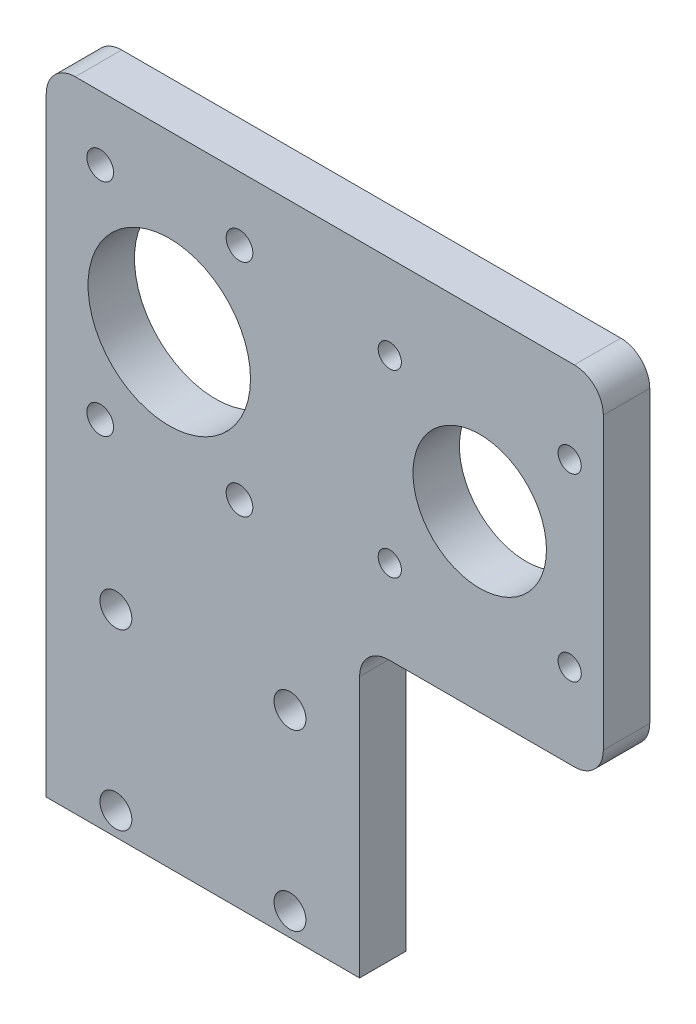
ISO-10303-21;
HEADER;
FILE_DESCRIPTION(('STEP AP214'),'2;1');
FILE_NAME('part.step','',(''),(''),'','','');
FILE_SCHEMA(('AUTOMOTIVE_DESIGN { 1 0 10303 214 1 1 1 1 }'));
ENDSEC;
DATA;
#1=APPLICATION_CONTEXT('core data for automotive mechanical design processes');
#2=APPLICATION_PROTOCOL_DEFINITION('international standard','automotive_design',2000,#1);
#3=PRODUCT_CONTEXT('',#1,'mechanical');
#4=PRODUCT('Part','Part','',(#3));
#5=PRODUCT_RELATED_PRODUCT_CATEGORY('part','',(#4));
#6=PRODUCT_DEFINITION_FORMATION('','',#4);
#7=PRODUCT_DEFINITION_CONTEXT('part definition',#1,'design');
#8=PRODUCT_DEFINITION('design','',#6,#7);
#9=PRODUCT_DEFINITION_SHAPE('','',#8);
#10=(LENGTH_UNIT() NAMED_UNIT(*) SI_UNIT(.MILLI.,.METRE.));
#11=(NAMED_UNIT(*) PLANE_ANGLE_UNIT() SI_UNIT($,.RADIAN.));
#12=(NAMED_UNIT(*) SI_UNIT($,.STERADIAN.) SOLID_ANGLE_UNIT());
#13=UNCERTAINTY_MEASURE_WITH_UNIT(LENGTH_MEASURE(1.E-05),#10,'distance_accuracy_value','');
#14=(GEOMETRIC_REPRESENTATION_CONTEXT(3) GLOBAL_UNCERTAINTY_ASSIGNED_CONTEXT((#13)) GLOBAL_UNIT_ASSIGNED_CONTEXT((#10,
#11,#12)) REPRESENTATION_CONTEXT('',''));
#15=CARTESIAN_POINT('',(0.,0.,0.));
#16=DIRECTION('',(0.,0.,1.));
#17=DIRECTION('',(1.,0.,0.));
#18=AXIS2_PLACEMENT_3D('',#15,#16,#17);
#19=CARTESIAN_POINT('',(0.,0.,8.));
#20=DIRECTION('',(0.,0.,1.));
#21=DIRECTION('',(1.,0.,0.));
#22=AXIS2_PLACEMENT_3D('',#19,#20,#21);
#23=PLANE('',#22);
#24=CARTESIAN_POINT('',(9.3000000000004,-49.,8.));
#25=DIRECTION('',(0.,0.,1.));
#26=DIRECTION('',(1.,0.,0.));
#27=AXIS2_PLACEMENT_3D('',#24,#25,#26);
#28=CIRCLE('',#27,2.3);
#29=CARTESIAN_POINT('',(11.6000000000004,-49.,8.));
#30=VERTEX_POINT('',#29);
#31=EDGE_CURVE('E493',#30,#30,#28,.T.);
#32=ORIENTED_EDGE('',*,*,#31,.F.);
#33=EDGE_LOOP('',(#32));
#34=FACE_BOUND('',#33,.T.);
#35=CARTESIAN_POINT('',(33.3000000000004,-49.,8.));
#36=DIRECTION('',(0.,0.,1.));
#37=DIRECTION('',(1.,0.,0.));
#38=AXIS2_PLACEMENT_3D('',#35,#36,#37);
#39=CIRCLE('',#38,2.30000000000001);
#40=CARTESIAN_POINT('',(35.6000000000004,-49.,8.));
#41=VERTEX_POINT('',#40);
#42=EDGE_CURVE('E494',#41,#41,#39,.T.);
#43=ORIENTED_EDGE('',*,*,#42,.F.);
#44=EDGE_LOOP('',(#43));
#45=FACE_BOUND('',#44,.T.);
#46=CARTESIAN_POINT('',(33.3,-11.,8.));
#47=DIRECTION('',(0.,0.,1.));
#48=DIRECTION('',(1.,0.,0.));
#49=AXIS2_PLACEMENT_3D('',#46,#47,#48);
#50=CIRCLE('',#49,2.3);
#51=CARTESIAN_POINT('',(35.6,-11.,8.));
#52=VERTEX_POINT('',#51);
#53=EDGE_CURVE('E497',#52,#52,#50,.T.);
#54=ORIENTED_EDGE('',*,*,#53,.F.);
#55=EDGE_LOOP('',(#54));
#56=FACE_BOUND('',#55,.T.);
#57=CARTESIAN_POINT('',(9.3,-11.,8.));
#58=DIRECTION('',(0.,0.,1.));
#59=DIRECTION('',(1.,0.,0.));
#60=AXIS2_PLACEMENT_3D('',#57,#58,#59);
#61=CIRCLE('',#60,2.3);
#62=CARTESIAN_POINT('',(11.6,-11.,8.));
#63=VERTEX_POINT('',#62);
#64=EDGE_CURVE('E179',#63,#63,#61,.T.);
#65=ORIENTED_EDGE('',*,*,#64,.F.);
#66=EDGE_LOOP('',(#65));
#67=FACE_BOUND('',#66,.T.);
#68=CARTESIAN_POINT('',(90.2000000000003,-45.5,8.));
#69=DIRECTION('',(0.,0.,1.));
#70=DIRECTION('',(1.,0.,0.));
#71=AXIS2_PLACEMENT_3D('',#68,#69,#70);
#72=CIRCLE('',#71,2.);
#73=CARTESIAN_POINT('',(92.2000000000003,-45.5,8.));
#74=VERTEX_POINT('',#73);
#75=EDGE_CURVE('E199',#74,#74,#72,.T.);
#76=ORIENTED_EDGE('',*,*,#75,.F.);
#77=EDGE_LOOP('',(#76));
#78=FACE_BOUND('',#77,.T.);
#79=CARTESIAN_POINT('',(59.2,-14.5,8.));
#80=DIRECTION('',(0.,0.,1.));
#81=DIRECTION('',(1.,0.,0.));
#82=AXIS2_PLACEMENT_3D('',#79,#80,#81);
#83=CIRCLE('',#82,2.);
#84=CARTESIAN_POINT('',(61.2,-14.5,8.));
#85=VERTEX_POINT('',#84);
#86=EDGE_CURVE('E211',#85,#85,#83,.T.);
#87=ORIENTED_EDGE('',*,*,#86,.F.);
#88=EDGE_LOOP('',(#87));
#89=FACE_BOUND('',#88,.T.);
#90=CARTESIAN_POINT('',(11.9999999999999,-76.,8.));
#91=DIRECTION('',(0.,0.,1.));
#92=DIRECTION('',(1.,0.,0.));
#93=AXIS2_PLACEMENT_3D('',#90,#91,#92);
#94=CIRCLE('',#93,2.75);
#95=CARTESIAN_POINT('',(14.7499999999999,-76.,8.));
#96=VERTEX_POINT('',#95);
#97=EDGE_CURVE('E223',#96,#96,#94,.T.);
#98=ORIENTED_EDGE('',*,*,#97,.F.);
#99=EDGE_LOOP('',(#98));
#100=FACE_BOUND('',#99,.T.);
#101=CARTESIAN_POINT('',(42.,-106.,8.));
#102=DIRECTION('',(0.,0.,1.));
#103=DIRECTION('',(1.,0.,0.));
#104=AXIS2_PLACEMENT_3D('',#101,#102,#103);
#105=CIRCLE('',#104,2.75);
#106=CARTESIAN_POINT('',(44.75,-106.,8.));
#107=VERTEX_POINT('',#106);
#108=EDGE_CURVE('E235',#107,#107,#105,.T.);
#109=ORIENTED_EDGE('',*,*,#108,.F.);
#110=EDGE_LOOP('',(#109));
#111=FACE_BOUND('',#110,.T.);
#112=CARTESIAN_POINT('',(12.,-106.,8.));
#113=DIRECTION('',(0.,0.,1.));
#114=DIRECTION('',(1.,0.,0.));
#115=AXIS2_PLACEMENT_3D('',#112,#113,#114);
#116=CIRCLE('',#115,2.75);
#117=CARTESIAN_POINT('',(14.75,-106.,8.));
#118=VERTEX_POINT('',#117);
#119=EDGE_CURVE('E247',#118,#118,#116,.T.);
#120=ORIENTED_EDGE('',*,*,#119,.F.);
#121=EDGE_LOOP('',(#120));
#122=FACE_BOUND('',#121,.T.);
#123=DIRECTION('',(1.,0.,0.));
#124=VECTOR('',#123,1.);
#125=CARTESIAN_POINT('',(54.,-60.,8.));
#126=LINE('',#125,#124);
#127=CARTESIAN_POINT('',(59.,-60.,8.));
#128=VERTEX_POINT('',#127);
#129=CARTESIAN_POINT('',(91.,-60.,8.));
#130=VERTEX_POINT('',#129);
#131=EDGE_CURVE('E253',#128,#130,#126,.T.);
#132=ORIENTED_EDGE('',*,*,#131,.T.);
#133=CARTESIAN_POINT('',(91.,-55.,8.));
#134=DIRECTION('',(0.,0.,1.));
#135=DIRECTION('',(1.,0.,0.));
#136=AXIS2_PLACEMENT_3D('',#133,#134,#135);
#137=CIRCLE('',#136,5.);
#138=CARTESIAN_POINT('',(96.,-55.,8.));
#139=VERTEX_POINT('',#138);
#140=EDGE_CURVE('E166',#130,#139,#137,.T.);
#141=ORIENTED_EDGE('',*,*,#140,.T.);
#142=DIRECTION('',(0.,1.,0.));
#143=VECTOR('',#142,1.);
#144=CARTESIAN_POINT('',(96.,0.,8.));
#145=LINE('',#144,#143);
#146=CARTESIAN_POINT('',(96.,-5.,8.));
#147=VERTEX_POINT('',#146);
#148=EDGE_CURVE('E255',#139,#147,#145,.T.);
#149=ORIENTED_EDGE('',*,*,#148,.T.);
#150=CARTESIAN_POINT('',(91.,-5.,8.));
#151=DIRECTION('',(0.,0.,1.));
#152=DIRECTION('',(1.,0.,0.));
#153=AXIS2_PLACEMENT_3D('',#150,#151,#152);
#154=CIRCLE('',#153,5.);
#155=CARTESIAN_POINT('',(91.,0.,8.));
#156=VERTEX_POINT('',#155);
#157=EDGE_CURVE('E59',#147,#156,#154,.T.);
#158=ORIENTED_EDGE('',*,*,#157,.T.);
#159=DIRECTION('',(-1.,0.,0.));
#160=VECTOR('',#159,1.);
#161=CARTESIAN_POINT('',(54.,0.,8.));
#162=LINE('',#161,#160);
#163=CARTESIAN_POINT('',(5.00000000000001,0.,8.));
#164=VERTEX_POINT('',#163);
#165=EDGE_CURVE('E145',#156,#164,#162,.T.);
#166=ORIENTED_EDGE('',*,*,#165,.T.);
#167=CARTESIAN_POINT('',(5.,-5.,8.));
#168=DIRECTION('',(0.,0.,1.));
#169=DIRECTION('',(1.,0.,0.));
#170=AXIS2_PLACEMENT_3D('',#167,#168,#169);
#171=CIRCLE('',#170,5.);
#172=CARTESIAN_POINT('',(0.,-5.,8.));
#173=VERTEX_POINT('',#172);
#174=EDGE_CURVE('E121',#164,#173,#171,.T.);
#175=ORIENTED_EDGE('',*,*,#174,.T.);
#176=DIRECTION('',(0.,-1.,0.));
#177=VECTOR('',#176,1.);
#178=CARTESIAN_POINT('',(0.,0.,8.));
#179=LINE('',#178,#177);
#180=CARTESIAN_POINT('',(0.,-110.,8.));
#181=VERTEX_POINT('',#180);
#182=EDGE_CURVE('E113',#173,#181,#179,.T.);
#183=ORIENTED_EDGE('',*,*,#182,.T.);
#184=DIRECTION('',(1.,0.,0.));
#185=VECTOR('',#184,1.);
#186=CARTESIAN_POINT('',(0.,-110.,8.));
#187=LINE('',#186,#185);
#188=CARTESIAN_POINT('',(54.,-110.,8.));
#189=VERTEX_POINT('',#188);
#190=EDGE_CURVE('E118',#181,#189,#187,.T.);
#191=ORIENTED_EDGE('',*,*,#190,.T.);
#192=DIRECTION('',(0.,1.,0.));
#193=VECTOR('',#192,1.);
#194=CARTESIAN_POINT('',(54.,-60.,8.));
#195=LINE('',#194,#193);
#196=CARTESIAN_POINT('',(54.,-65.,8.));
#197=VERTEX_POINT('',#196);
#198=EDGE_CURVE('E135',#189,#197,#195,.T.);
#199=ORIENTED_EDGE('',*,*,#198,.T.);
#200=CARTESIAN_POINT('',(59.,-65.,8.));
#201=DIRECTION('',(0.,0.,1.));
#202=DIRECTION('',(1.,0.,0.));
#203=AXIS2_PLACEMENT_3D('',#200,#201,#202);
#204=CIRCLE('',#203,5.);
#205=EDGE_CURVE('E11',#197,#128,#204,.F.);
#206=ORIENTED_EDGE('',*,*,#205,.T.);
#207=EDGE_LOOP('',(#132,#141,#149,#158,#166,#175,#183,#191,#199,#206));
#208=FACE_BOUND('',#207,.T.);
#209=CARTESIAN_POINT('',(21.2,-30.,8.));
#210=DIRECTION('',(0.,0.,1.));
#211=DIRECTION('',(1.,0.,0.));
#212=AXIS2_PLACEMENT_3D('',#209,#210,#211);
#213=CIRCLE('',#212,14.);
#214=CARTESIAN_POINT('',(35.2,-30.,8.));
#215=VERTEX_POINT('',#214);
#216=EDGE_CURVE('E241',#215,#215,#213,.T.);
#217=ORIENTED_EDGE('',*,*,#216,.F.);
#218=EDGE_LOOP('',(#217));
#219=FACE_BOUND('',#218,.T.);
#220=CARTESIAN_POINT('',(41.9999999999999,-76.,8.));
#221=DIRECTION('',(0.,0.,1.));
#222=DIRECTION('',(1.,0.,0.));
#223=AXIS2_PLACEMENT_3D('',#220,#221,#222);
#224=CIRCLE('',#223,2.75);
#225=CARTESIAN_POINT('',(44.7499999999999,-76.,8.));
#226=VERTEX_POINT('',#225);
#227=EDGE_CURVE('E229',#226,#226,#224,.T.);
#228=ORIENTED_EDGE('',*,*,#227,.F.);
#229=EDGE_LOOP('',(#228));
#230=FACE_BOUND('',#229,.T.);
#231=CARTESIAN_POINT('',(74.7,-30.,8.));
#232=DIRECTION('',(0.,0.,1.));
#233=DIRECTION('',(1.,0.,0.));
#234=AXIS2_PLACEMENT_3D('',#231,#232,#233);
#235=CIRCLE('',#234,11.5);
#236=CARTESIAN_POINT('',(86.2,-30.,8.));
#237=VERTEX_POINT('',#236);
#238=EDGE_CURVE('E217',#237,#237,#235,.T.);
#239=ORIENTED_EDGE('',*,*,#238,.F.);
#240=EDGE_LOOP('',(#239));
#241=FACE_BOUND('',#240,.T.);
#242=CARTESIAN_POINT('',(90.2,-14.5,8.));
#243=DIRECTION('',(0.,0.,1.));
#244=DIRECTION('',(1.,0.,0.));
#245=AXIS2_PLACEMENT_3D('',#242,#243,#244);
#246=CIRCLE('',#245,2.);
#247=CARTESIAN_POINT('',(92.2,-14.5,8.));
#248=VERTEX_POINT('',#247);
#249=EDGE_CURVE('E205',#248,#248,#246,.T.);
#250=ORIENTED_EDGE('',*,*,#249,.F.);
#251=EDGE_LOOP('',(#250));
#252=FACE_BOUND('',#251,.T.);
#253=CARTESIAN_POINT('',(59.2000000000003,-45.5,8.));
#254=DIRECTION('',(0.,0.,1.));
#255=DIRECTION('',(1.,0.,0.));
#256=AXIS2_PLACEMENT_3D('',#253,#254,#255);
#257=CIRCLE('',#256,2.);
#258=CARTESIAN_POINT('',(61.2000000000003,-45.5,8.));
#259=VERTEX_POINT('',#258);
#260=EDGE_CURVE('E190',#259,#259,#257,.T.);
#261=ORIENTED_EDGE('',*,*,#260,.F.);
#262=EDGE_LOOP('',(#261));
#263=FACE_BOUND('',#262,.T.);
#264=ADVANCED_FACE('F35',(#34,#45,#56,#67,#78,#89,#100,#111,#122,#208,#219,#230,#241,#252,#263),
#23,.T.);
#265=CARTESIAN_POINT('',(0.,0.,0.));
#266=DIRECTION('',(0.,0.,1.));
#267=DIRECTION('',(1.,0.,0.));
#268=AXIS2_PLACEMENT_3D('',#265,#266,#267);
#269=PLANE('',#268);
#270=CARTESIAN_POINT('',(9.3000000000004,-49.,0.));
#271=DIRECTION('',(0.,0.,1.));
#272=DIRECTION('',(1.,0.,0.));
#273=AXIS2_PLACEMENT_3D('',#270,#271,#272);
#274=CIRCLE('',#273,2.3);
#275=CARTESIAN_POINT('',(11.6000000000004,-49.,0.));
#276=VERTEX_POINT('',#275);
#277=EDGE_CURVE('E39',#276,#276,#274,.T.);
#278=ORIENTED_EDGE('',*,*,#277,.T.);
#279=EDGE_LOOP('',(#278));
#280=FACE_BOUND('',#279,.T.);
#281=CARTESIAN_POINT('',(33.3000000000004,-49.,0.));
#282=DIRECTION('',(0.,0.,1.));
#283=DIRECTION('',(1.,0.,0.));
#284=AXIS2_PLACEMENT_3D('',#281,#282,#283);
#285=CIRCLE('',#284,2.30000000000001);
#286=CARTESIAN_POINT('',(35.6000000000004,-49.,0.));
#287=VERTEX_POINT('',#286);
#288=EDGE_CURVE('E181',#287,#287,#285,.T.);
#289=ORIENTED_EDGE('',*,*,#288,.T.);
#290=EDGE_LOOP('',(#289));
#291=FACE_BOUND('',#290,.T.);
#292=CARTESIAN_POINT('',(33.3,-11.,0.));
#293=DIRECTION('',(0.,0.,1.));
#294=DIRECTION('',(1.,0.,0.));
#295=AXIS2_PLACEMENT_3D('',#292,#293,#294);
#296=CIRCLE('',#295,2.3);
#297=CARTESIAN_POINT('',(35.6,-11.,0.));
#298=VERTEX_POINT('',#297);
#299=EDGE_CURVE('E178',#298,#298,#296,.T.);
#300=ORIENTED_EDGE('',*,*,#299,.T.);
#301=EDGE_LOOP('',(#300));
#302=FACE_BOUND('',#301,.T.);
#303=CARTESIAN_POINT('',(9.3,-11.,0.));
#304=DIRECTION('',(0.,0.,1.));
#305=DIRECTION('',(1.,0.,0.));
#306=AXIS2_PLACEMENT_3D('',#303,#304,#305);
#307=CIRCLE('',#306,2.3);
#308=CARTESIAN_POINT('',(11.6,-11.,0.));
#309=VERTEX_POINT('',#308);
#310=EDGE_CURVE('E175',#309,#309,#307,.T.);
#311=ORIENTED_EDGE('',*,*,#310,.T.);
#312=EDGE_LOOP('',(#311));
#313=FACE_BOUND('',#312,.T.);
#314=DIRECTION('',(0.,1.,0.));
#315=VECTOR('',#314,1.);
#316=CARTESIAN_POINT('',(96.,0.,0.));
#317=LINE('',#316,#315);
#318=CARTESIAN_POINT('',(96.,-55.,0.));
#319=VERTEX_POINT('',#318);
#320=CARTESIAN_POINT('',(96.,-5.,0.));
#321=VERTEX_POINT('',#320);
#322=EDGE_CURVE('E267',#319,#321,#317,.T.);
#323=ORIENTED_EDGE('',*,*,#322,.F.);
#324=CARTESIAN_POINT('',(91.,-55.,0.));
#325=DIRECTION('',(0.,0.,1.));
#326=DIRECTION('',(1.,0.,0.));
#327=AXIS2_PLACEMENT_3D('',#324,#325,#326);
#328=CIRCLE('',#327,5.);
#329=CARTESIAN_POINT('',(91.,-60.,0.));
#330=VERTEX_POINT('',#329);
#331=EDGE_CURVE('E162',#319,#330,#328,.F.);
#332=ORIENTED_EDGE('',*,*,#331,.T.);
#333=DIRECTION('',(1.,0.,0.));
#334=VECTOR('',#333,1.);
#335=CARTESIAN_POINT('',(54.,-60.,0.));
#336=LINE('',#335,#334);
#337=CARTESIAN_POINT('',(59.,-60.,0.));
#338=VERTEX_POINT('',#337);
#339=EDGE_CURVE('E264',#338,#330,#336,.T.);
#340=ORIENTED_EDGE('',*,*,#339,.F.);
#341=CARTESIAN_POINT('',(59.,-65.,0.));
#342=DIRECTION('',(0.,0.,1.));
#343=DIRECTION('',(1.,0.,0.));
#344=AXIS2_PLACEMENT_3D('',#341,#342,#343);
#345=CIRCLE('',#344,5.);
#346=CARTESIAN_POINT('',(54.,-65.,0.));
#347=VERTEX_POINT('',#346);
#348=EDGE_CURVE('E44',#338,#347,#345,.T.);
#349=ORIENTED_EDGE('',*,*,#348,.T.);
#350=DIRECTION('',(0.,1.,0.));
#351=VECTOR('',#350,1.);
#352=CARTESIAN_POINT('',(54.,-60.,0.));
#353=LINE('',#352,#351);
#354=CARTESIAN_POINT('',(54.,-110.,0.));
#355=VERTEX_POINT('',#354);
#356=EDGE_CURVE('E261',#355,#347,#353,.T.);
#357=ORIENTED_EDGE('',*,*,#356,.F.);
#358=DIRECTION('',(1.,0.,0.));
#359=VECTOR('',#358,1.);
#360=CARTESIAN_POINT('',(0.,-110.,0.));
#361=LINE('',#360,#359);
#362=CARTESIAN_POINT('',(0.,-110.,0.));
#363=VERTEX_POINT('',#362);
#364=EDGE_CURVE('E259',#363,#355,#361,.T.);
#365=ORIENTED_EDGE('',*,*,#364,.F.);
#366=DIRECTION('',(0.,-1.,0.));
#367=VECTOR('',#366,1.);
#368=CARTESIAN_POINT('',(0.,0.,0.));
#369=LINE('',#368,#367);
#370=CARTESIAN_POINT('',(0.,-5.,0.));
#371=VERTEX_POINT('',#370);
#372=EDGE_CURVE('E139',#371,#363,#369,.T.);
#373=ORIENTED_EDGE('',*,*,#372,.F.);
#374=CARTESIAN_POINT('',(5.,-5.,0.));
#375=DIRECTION('',(0.,0.,1.));
#376=DIRECTION('',(1.,0.,0.));
#377=AXIS2_PLACEMENT_3D('',#374,#375,#376);
#378=CIRCLE('',#377,5.);
#379=CARTESIAN_POINT('',(5.,0.,0.));
#380=VERTEX_POINT('',#379);
#381=EDGE_CURVE('E158',#371,#380,#378,.F.);
#382=ORIENTED_EDGE('',*,*,#381,.T.);
#383=DIRECTION('',(-1.,0.,0.));
#384=VECTOR('',#383,1.);
#385=CARTESIAN_POINT('',(0.,0.,0.));
#386=LINE('',#385,#384);
#387=CARTESIAN_POINT('',(91.,0.,0.));
#388=VERTEX_POINT('',#387);
#389=EDGE_CURVE('E126',#388,#380,#386,.T.);
#390=ORIENTED_EDGE('',*,*,#389,.F.);
#391=CARTESIAN_POINT('',(91.,-5.,0.));
#392=DIRECTION('',(0.,0.,1.));
#393=DIRECTION('',(1.,0.,0.));
#394=AXIS2_PLACEMENT_3D('',#391,#392,#393);
#395=CIRCLE('',#394,5.);
#396=EDGE_CURVE('E160',#388,#321,#395,.F.);
#397=ORIENTED_EDGE('',*,*,#396,.T.);
#398=EDGE_LOOP('',(#323,#332,#340,#349,#357,#365,#373,#382,#390,#397));
#399=FACE_BOUND('',#398,.T.);
#400=CARTESIAN_POINT('',(12.,-106.,0.));
#401=DIRECTION('',(0.,0.,1.));
#402=DIRECTION('',(1.,0.,0.));
#403=AXIS2_PLACEMENT_3D('',#400,#401,#402);
#404=CIRCLE('',#403,2.75);
#405=CARTESIAN_POINT('',(14.75,-106.,0.));
#406=VERTEX_POINT('',#405);
#407=EDGE_CURVE('E244',#406,#406,#404,.T.);
#408=ORIENTED_EDGE('',*,*,#407,.T.);
#409=EDGE_LOOP('',(#408));
#410=FACE_BOUND('',#409,.T.);
#411=CARTESIAN_POINT('',(21.2,-30.,0.));
#412=DIRECTION('',(0.,0.,1.));
#413=DIRECTION('',(1.,0.,0.));
#414=AXIS2_PLACEMENT_3D('',#411,#412,#413);
#415=CIRCLE('',#414,14.);
#416=CARTESIAN_POINT('',(35.2,-30.,0.));
#417=VERTEX_POINT('',#416);
#418=EDGE_CURVE('E238',#417,#417,#415,.T.);
#419=ORIENTED_EDGE('',*,*,#418,.T.);
#420=EDGE_LOOP('',(#419));
#421=FACE_BOUND('',#420,.T.);
#422=CARTESIAN_POINT('',(42.,-106.,0.));
#423=DIRECTION('',(0.,0.,1.));
#424=DIRECTION('',(1.,0.,0.));
#425=AXIS2_PLACEMENT_3D('',#422,#423,#424);
#426=CIRCLE('',#425,2.75);
#427=CARTESIAN_POINT('',(44.75,-106.,0.));
#428=VERTEX_POINT('',#427);
#429=EDGE_CURVE('E232',#428,#428,#426,.T.);
#430=ORIENTED_EDGE('',*,*,#429,.T.);
#431=EDGE_LOOP('',(#430));
#432=FACE_BOUND('',#431,.T.);
#433=CARTESIAN_POINT('',(41.9999999999999,-76.,0.));
#434=DIRECTION('',(0.,0.,1.));
#435=DIRECTION('',(1.,0.,0.));
#436=AXIS2_PLACEMENT_3D('',#433,#434,#435);
#437=CIRCLE('',#436,2.75);
#438=CARTESIAN_POINT('',(44.7499999999999,-76.,0.));
#439=VERTEX_POINT('',#438);
#440=EDGE_CURVE('E226',#439,#439,#437,.T.);
#441=ORIENTED_EDGE('',*,*,#440,.T.);
#442=EDGE_LOOP('',(#441));
#443=FACE_BOUND('',#442,.T.);
#444=CARTESIAN_POINT('',(11.9999999999999,-76.,0.));
#445=DIRECTION('',(0.,0.,1.));
#446=DIRECTION('',(1.,0.,0.));
#447=AXIS2_PLACEMENT_3D('',#444,#445,#446);
#448=CIRCLE('',#447,2.75);
#449=CARTESIAN_POINT('',(14.7499999999999,-76.,0.));
#450=VERTEX_POINT('',#449);
#451=EDGE_CURVE('E220',#450,#450,#448,.T.);
#452=ORIENTED_EDGE('',*,*,#451,.T.);
#453=EDGE_LOOP('',(#452));
#454=FACE_BOUND('',#453,.T.);
#455=CARTESIAN_POINT('',(74.7,-30.,0.));
#456=DIRECTION('',(0.,0.,1.));
#457=DIRECTION('',(1.,0.,0.));
#458=AXIS2_PLACEMENT_3D('',#455,#456,#457);
#459=CIRCLE('',#458,11.5);
#460=CARTESIAN_POINT('',(86.2,-30.,0.));
#461=VERTEX_POINT('',#460);
#462=EDGE_CURVE('E214',#461,#461,#459,.T.);
#463=ORIENTED_EDGE('',*,*,#462,.T.);
#464=EDGE_LOOP('',(#463));
#465=FACE_BOUND('',#464,.T.);
#466=CARTESIAN_POINT('',(59.2,-14.5,0.));
#467=DIRECTION('',(0.,0.,1.));
#468=DIRECTION('',(1.,0.,0.));
#469=AXIS2_PLACEMENT_3D('',#466,#467,#468);
#470=CIRCLE('',#469,2.);
#471=CARTESIAN_POINT('',(61.2,-14.5,0.));
#472=VERTEX_POINT('',#471);
#473=EDGE_CURVE('E208',#472,#472,#470,.T.);
#474=ORIENTED_EDGE('',*,*,#473,.T.);
#475=EDGE_LOOP('',(#474));
#476=FACE_BOUND('',#475,.T.);
#477=CARTESIAN_POINT('',(90.2,-14.5,0.));
#478=DIRECTION('',(0.,0.,1.));
#479=DIRECTION('',(1.,0.,0.));
#480=AXIS2_PLACEMENT_3D('',#477,#478,#479);
#481=CIRCLE('',#480,2.);
#482=CARTESIAN_POINT('',(92.2,-14.5,0.));
#483=VERTEX_POINT('',#482);
#484=EDGE_CURVE('E202',#483,#483,#481,.T.);
#485=ORIENTED_EDGE('',*,*,#484,.T.);
#486=EDGE_LOOP('',(#485));
#487=FACE_BOUND('',#486,.T.);
#488=CARTESIAN_POINT('',(90.2000000000003,-45.5,0.));
#489=DIRECTION('',(0.,0.,1.));
#490=DIRECTION('',(1.,0.,0.));
#491=AXIS2_PLACEMENT_3D('',#488,#489,#490);
#492=CIRCLE('',#491,2.);
#493=CARTESIAN_POINT('',(92.2000000000003,-45.5,0.));
#494=VERTEX_POINT('',#493);
#495=EDGE_CURVE('E195',#494,#494,#492,.T.);
#496=ORIENTED_EDGE('',*,*,#495,.T.);
#497=EDGE_LOOP('',(#496));
#498=FACE_BOUND('',#497,.T.);
#499=CARTESIAN_POINT('',(59.2000000000003,-45.5,0.));
#500=DIRECTION('',(0.,0.,1.));
#501=DIRECTION('',(1.,0.,0.));
#502=AXIS2_PLACEMENT_3D('',#499,#500,#501);
#503=CIRCLE('',#502,2.);
#504=CARTESIAN_POINT('',(61.2000000000003,-45.5,0.));
#505=VERTEX_POINT('',#504);
#506=EDGE_CURVE('E186',#505,#505,#503,.T.);
#507=ORIENTED_EDGE('',*,*,#506,.T.);
#508=EDGE_LOOP('',(#507));
#509=FACE_BOUND('',#508,.T.);
#510=ADVANCED_FACE('F275',(#280,#291,#302,#313,#399,#410,#421,#432,#443,#454,#465,#476,#487,
#498,#509),#269,.F.);
#511=CARTESIAN_POINT('',(0.,0.,8.));
#512=DIRECTION('',(1.,0.,0.));
#513=DIRECTION('',(0.,1.,0.));
#514=AXIS2_PLACEMENT_3D('',#511,#512,#513);
#515=PLANE('',#514);
#516=ORIENTED_EDGE('',*,*,#182,.F.);
#517=DIRECTION('',(0.,0.,-1.));
#518=VECTOR('',#517,1.);
#519=CARTESIAN_POINT('',(0.,-5.,8.));
#520=LINE('',#519,#518);
#521=EDGE_CURVE('E172',#173,#371,#520,.T.);
#522=ORIENTED_EDGE('',*,*,#521,.T.);
#523=ORIENTED_EDGE('',*,*,#372,.T.);
#524=DIRECTION('',(0.,0.,-1.));
#525=VECTOR('',#524,1.);
#526=CARTESIAN_POINT('',(0.,-110.,8.));
#527=LINE('',#526,#525);
#528=EDGE_CURVE('E131',#181,#363,#527,.T.);
#529=ORIENTED_EDGE('',*,*,#528,.F.);
#530=EDGE_LOOP('',(#516,#522,#523,#529));
#531=FACE_BOUND('',#530,.T.);
#532=ADVANCED_FACE('F137',(#531),#515,.F.);
#533=CARTESIAN_POINT('',(0.,-110.,8.));
#534=DIRECTION('',(0.,1.,0.));
#535=DIRECTION('',(0.,0.,1.));
#536=AXIS2_PLACEMENT_3D('',#533,#534,#535);
#537=PLANE('',#536);
#538=ORIENTED_EDGE('',*,*,#364,.T.);
#539=DIRECTION('',(0.,0.,-1.));
#540=VECTOR('',#539,1.);
#541=CARTESIAN_POINT('',(54.,-110.,8.));
#542=LINE('',#541,#540);
#543=EDGE_CURVE('E133',#189,#355,#542,.T.);
#544=ORIENTED_EDGE('',*,*,#543,.F.);
#545=ORIENTED_EDGE('',*,*,#190,.F.);
#546=ORIENTED_EDGE('',*,*,#528,.T.);
#547=EDGE_LOOP('',(#538,#544,#545,#546));
#548=FACE_BOUND('',#547,.T.);
#549=ADVANCED_FACE('F130',(#548),#537,.F.);
#550=CARTESIAN_POINT('',(54.,-60.,8.));
#551=DIRECTION('',(-1.,0.,0.));
#552=DIRECTION('',(0.,-1.,0.));
#553=AXIS2_PLACEMENT_3D('',#550,#551,#552);
#554=PLANE('',#553);
#555=ORIENTED_EDGE('',*,*,#356,.T.);
#556=DIRECTION('',(0.,0.,-1.));
#557=VECTOR('',#556,1.);
#558=CARTESIAN_POINT('',(54.,-65.,8.));
#559=LINE('',#558,#557);
#560=EDGE_CURVE('E151',#347,#197,#559,.F.);
#561=ORIENTED_EDGE('',*,*,#560,.T.);
#562=ORIENTED_EDGE('',*,*,#198,.F.);
#563=ORIENTED_EDGE('',*,*,#543,.T.);
#564=EDGE_LOOP('',(#555,#561,#562,#563));
#565=FACE_BOUND('',#564,.T.);
#566=ADVANCED_FACE('F279',(#565),#554,.F.);
#567=CARTESIAN_POINT('',(54.,-60.,8.));
#568=DIRECTION('',(0.,1.,0.));
#569=DIRECTION('',(0.,0.,1.));
#570=AXIS2_PLACEMENT_3D('',#567,#568,#569);
#571=PLANE('',#570);
#572=ORIENTED_EDGE('',*,*,#131,.F.);
#573=DIRECTION('',(0.,0.,-1.));
#574=VECTOR('',#573,1.);
#575=CARTESIAN_POINT('',(59.,-60.,0.));
#576=LINE('',#575,#574);
#577=EDGE_CURVE('E143',#128,#338,#576,.T.);
#578=ORIENTED_EDGE('',*,*,#577,.T.);
#579=ORIENTED_EDGE('',*,*,#339,.T.);
#580=DIRECTION('',(0.,0.,-1.));
#581=VECTOR('',#580,1.);
#582=CARTESIAN_POINT('',(91.,-60.,8.));
#583=LINE('',#582,#581);
#584=EDGE_CURVE('E141',#330,#130,#583,.F.);
#585=ORIENTED_EDGE('',*,*,#584,.T.);
#586=EDGE_LOOP('',(#572,#578,#579,#585));
#587=FACE_BOUND('',#586,.T.);
#588=ADVANCED_FACE('F288',(#587),#571,.F.);
#589=CARTESIAN_POINT('',(96.,0.,8.));
#590=DIRECTION('',(-1.,0.,0.));
#591=DIRECTION('',(0.,-1.,0.));
#592=AXIS2_PLACEMENT_3D('',#589,#590,#591);
#593=PLANE('',#592);
#594=ORIENTED_EDGE('',*,*,#148,.F.);
#595=DIRECTION('',(0.,0.,-1.));
#596=VECTOR('',#595,1.);
#597=CARTESIAN_POINT('',(96.,-55.,8.));
#598=LINE('',#597,#596);
#599=EDGE_CURVE('E155',#139,#319,#598,.T.);
#600=ORIENTED_EDGE('',*,*,#599,.T.);
#601=ORIENTED_EDGE('',*,*,#322,.T.);
#602=DIRECTION('',(0.,0.,-1.));
#603=VECTOR('',#602,1.);
#604=CARTESIAN_POINT('',(96.,-5.,8.));
#605=LINE('',#604,#603);
#606=EDGE_CURVE('E153',#321,#147,#605,.F.);
#607=ORIENTED_EDGE('',*,*,#606,.T.);
#608=EDGE_LOOP('',(#594,#600,#601,#607));
#609=FACE_BOUND('',#608,.T.);
#610=ADVANCED_FACE('F296',(#609),#593,.F.);
#611=CARTESIAN_POINT('',(0.,0.,8.));
#612=DIRECTION('',(0.,-1.,0.));
#613=DIRECTION('',(0.,0.,-1.));
#614=AXIS2_PLACEMENT_3D('',#611,#612,#613);
#615=PLANE('',#614);
#616=ORIENTED_EDGE('',*,*,#165,.F.);
#617=DIRECTION('',(0.,0.,-1.));
#618=VECTOR('',#617,1.);
#619=CARTESIAN_POINT('',(91.,0.,8.));
#620=LINE('',#619,#618);
#621=EDGE_CURVE('E169',#156,#388,#620,.T.);
#622=ORIENTED_EDGE('',*,*,#621,.T.);
#623=ORIENTED_EDGE('',*,*,#389,.T.);
#624=DIRECTION('',(0.,0.,-1.));
#625=VECTOR('',#624,1.);
#626=CARTESIAN_POINT('',(5.,0.,8.));
#627=LINE('',#626,#625);
#628=EDGE_CURVE('E52',#380,#164,#627,.F.);
#629=ORIENTED_EDGE('',*,*,#628,.T.);
#630=EDGE_LOOP('',(#616,#622,#623,#629));
#631=FACE_BOUND('',#630,.T.);
#632=ADVANCED_FACE('F270',(#631),#615,.F.);
#633=CARTESIAN_POINT('',(12.,-106.,8.));
#634=DIRECTION('',(0.,0.,-1.));
#635=DIRECTION('',(-1.,0.,0.));
#636=AXIS2_PLACEMENT_3D('',#633,#634,#635);
#637=CYLINDRICAL_SURFACE('',#636,2.75);
#638=ORIENTED_EDGE('',*,*,#119,.T.);
#639=EDGE_LOOP('',(#638));
#640=FACE_BOUND('',#639,.T.);
#641=ORIENTED_EDGE('',*,*,#407,.F.);
#642=EDGE_LOOP('',(#641));
#643=FACE_BOUND('',#642,.T.);
#644=ADVANCED_FACE('F317',(#640,#643),#637,.F.);
#645=CARTESIAN_POINT('',(21.2,-30.,8.));
#646=DIRECTION('',(0.,0.,-1.));
#647=DIRECTION('',(-1.,0.,0.));
#648=AXIS2_PLACEMENT_3D('',#645,#646,#647);
#649=CYLINDRICAL_SURFACE('',#648,14.);
#650=ORIENTED_EDGE('',*,*,#216,.T.);
#651=EDGE_LOOP('',(#650));
#652=FACE_BOUND('',#651,.T.);
#653=ORIENTED_EDGE('',*,*,#418,.F.);
#654=EDGE_LOOP('',(#653));
#655=FACE_BOUND('',#654,.T.);
#656=ADVANCED_FACE('F371',(#652,#655),#649,.F.);
#657=CARTESIAN_POINT('',(42.,-106.,8.));
#658=DIRECTION('',(0.,0.,-1.));
#659=DIRECTION('',(-1.,0.,0.));
#660=AXIS2_PLACEMENT_3D('',#657,#658,#659);
#661=CYLINDRICAL_SURFACE('',#660,2.75);
#662=ORIENTED_EDGE('',*,*,#108,.T.);
#663=EDGE_LOOP('',(#662));
#664=FACE_BOUND('',#663,.T.);
#665=ORIENTED_EDGE('',*,*,#429,.F.);
#666=EDGE_LOOP('',(#665));
#667=FACE_BOUND('',#666,.T.);
#668=ADVANCED_FACE('F368',(#664,#667),#661,.F.);
#669=CARTESIAN_POINT('',(41.9999999999999,-76.,8.));
#670=DIRECTION('',(0.,0.,-1.));
#671=DIRECTION('',(-1.,0.,0.));
#672=AXIS2_PLACEMENT_3D('',#669,#670,#671);
#673=CYLINDRICAL_SURFACE('',#672,2.75);
#674=ORIENTED_EDGE('',*,*,#227,.T.);
#675=EDGE_LOOP('',(#674));
#676=FACE_BOUND('',#675,.T.);
#677=ORIENTED_EDGE('',*,*,#440,.F.);
#678=EDGE_LOOP('',(#677));
#679=FACE_BOUND('',#678,.T.);
#680=ADVANCED_FACE('F364',(#676,#679),#673,.F.);
#681=CARTESIAN_POINT('',(11.9999999999999,-76.,8.));
#682=DIRECTION('',(0.,0.,-1.));
#683=DIRECTION('',(-1.,0.,0.));
#684=AXIS2_PLACEMENT_3D('',#681,#682,#683);
#685=CYLINDRICAL_SURFACE('',#684,2.75);
#686=ORIENTED_EDGE('',*,*,#97,.T.);
#687=EDGE_LOOP('',(#686));
#688=FACE_BOUND('',#687,.T.);
#689=ORIENTED_EDGE('',*,*,#451,.F.);
#690=EDGE_LOOP('',(#689));
#691=FACE_BOUND('',#690,.T.);
#692=ADVANCED_FACE('F360',(#688,#691),#685,.F.);
#693=CARTESIAN_POINT('',(74.7,-30.,8.));
#694=DIRECTION('',(0.,0.,-1.));
#695=DIRECTION('',(-1.,0.,0.));
#696=AXIS2_PLACEMENT_3D('',#693,#694,#695);
#697=CYLINDRICAL_SURFACE('',#696,11.5);
#698=ORIENTED_EDGE('',*,*,#238,.T.);
#699=EDGE_LOOP('',(#698));
#700=FACE_BOUND('',#699,.T.);
#701=ORIENTED_EDGE('',*,*,#462,.F.);
#702=EDGE_LOOP('',(#701));
#703=FACE_BOUND('',#702,.T.);
#704=ADVANCED_FACE('F356',(#700,#703),#697,.F.);
#705=CARTESIAN_POINT('',(59.2,-14.5,8.));
#706=DIRECTION('',(0.,0.,-1.));
#707=DIRECTION('',(-1.,0.,0.));
#708=AXIS2_PLACEMENT_3D('',#705,#706,#707);
#709=CYLINDRICAL_SURFACE('',#708,2.);
#710=ORIENTED_EDGE('',*,*,#86,.T.);
#711=EDGE_LOOP('',(#710));
#712=FACE_BOUND('',#711,.T.);
#713=ORIENTED_EDGE('',*,*,#473,.F.);
#714=EDGE_LOOP('',(#713));
#715=FACE_BOUND('',#714,.T.);
#716=ADVANCED_FACE('F352',(#712,#715),#709,.F.);
#717=CARTESIAN_POINT('',(90.2,-14.5,8.));
#718=DIRECTION('',(0.,0.,-1.));
#719=DIRECTION('',(-1.,0.,0.));
#720=AXIS2_PLACEMENT_3D('',#717,#718,#719);
#721=CYLINDRICAL_SURFACE('',#720,2.);
#722=ORIENTED_EDGE('',*,*,#249,.T.);
#723=EDGE_LOOP('',(#722));
#724=FACE_BOUND('',#723,.T.);
#725=ORIENTED_EDGE('',*,*,#484,.F.);
#726=EDGE_LOOP('',(#725));
#727=FACE_BOUND('',#726,.T.);
#728=ADVANCED_FACE('F343',(#724,#727),#721,.F.);
#729=CARTESIAN_POINT('',(90.2000000000003,-45.5,8.));
#730=DIRECTION('',(0.,0.,-1.));
#731=DIRECTION('',(-1.,0.,0.));
#732=AXIS2_PLACEMENT_3D('',#729,#730,#731);
#733=CYLINDRICAL_SURFACE('',#732,2.);
#734=ORIENTED_EDGE('',*,*,#75,.T.);
#735=EDGE_LOOP('',(#734));
#736=FACE_BOUND('',#735,.T.);
#737=ORIENTED_EDGE('',*,*,#495,.F.);
#738=EDGE_LOOP('',(#737));
#739=FACE_BOUND('',#738,.T.);
#740=ADVANCED_FACE('F337',(#736,#739),#733,.F.);
#741=CARTESIAN_POINT('',(59.2000000000003,-45.5,8.));
#742=DIRECTION('',(0.,0.,-1.));
#743=DIRECTION('',(-1.,0.,0.));
#744=AXIS2_PLACEMENT_3D('',#741,#742,#743);
#745=CYLINDRICAL_SURFACE('',#744,2.);
#746=ORIENTED_EDGE('',*,*,#260,.T.);
#747=EDGE_LOOP('',(#746));
#748=FACE_BOUND('',#747,.T.);
#749=ORIENTED_EDGE('',*,*,#506,.F.);
#750=EDGE_LOOP('',(#749));
#751=FACE_BOUND('',#750,.T.);
#752=ADVANCED_FACE('F333',(#748,#751),#745,.F.);
#753=CARTESIAN_POINT('',(59.,-65.,8.));
#754=DIRECTION('',(0.,0.,1.));
#755=DIRECTION('',(1.,0.,0.));
#756=AXIS2_PLACEMENT_3D('',#753,#754,#755);
#757=CYLINDRICAL_SURFACE('',#756,5.);
#758=ORIENTED_EDGE('',*,*,#205,.F.);
#759=ORIENTED_EDGE('',*,*,#560,.F.);
#760=ORIENTED_EDGE('',*,*,#348,.F.);
#761=ORIENTED_EDGE('',*,*,#577,.F.);
#762=EDGE_LOOP('',(#758,#759,#760,#761));
#763=FACE_BOUND('',#762,.T.);
#764=ADVANCED_FACE('F285',(#763),#757,.F.);
#765=CARTESIAN_POINT('',(91.,-55.,8.));
#766=DIRECTION('',(0.,0.,-1.));
#767=DIRECTION('',(-1.,0.,0.));
#768=AXIS2_PLACEMENT_3D('',#765,#766,#767);
#769=CYLINDRICAL_SURFACE('',#768,5.);
#770=ORIENTED_EDGE('',*,*,#140,.F.);
#771=ORIENTED_EDGE('',*,*,#584,.F.);
#772=ORIENTED_EDGE('',*,*,#331,.F.);
#773=ORIENTED_EDGE('',*,*,#599,.F.);
#774=EDGE_LOOP('',(#770,#771,#772,#773));
#775=FACE_BOUND('',#774,.T.);
#776=ADVANCED_FACE('F293',(#775),#769,.T.);
#777=CARTESIAN_POINT('',(91.,-5.,8.));
#778=DIRECTION('',(0.,0.,-1.));
#779=DIRECTION('',(-1.,0.,0.));
#780=AXIS2_PLACEMENT_3D('',#777,#778,#779);
#781=CYLINDRICAL_SURFACE('',#780,5.);
#782=ORIENTED_EDGE('',*,*,#157,.F.);
#783=ORIENTED_EDGE('',*,*,#606,.F.);
#784=ORIENTED_EDGE('',*,*,#396,.F.);
#785=ORIENTED_EDGE('',*,*,#621,.F.);
#786=EDGE_LOOP('',(#782,#783,#784,#785));
#787=FACE_BOUND('',#786,.T.);
#788=ADVANCED_FACE('F299',(#787),#781,.T.);
#789=CARTESIAN_POINT('',(5.,-5.,8.));
#790=DIRECTION('',(0.,0.,-1.));
#791=DIRECTION('',(-1.,0.,0.));
#792=AXIS2_PLACEMENT_3D('',#789,#790,#791);
#793=CYLINDRICAL_SURFACE('',#792,5.);
#794=ORIENTED_EDGE('',*,*,#174,.F.);
#795=ORIENTED_EDGE('',*,*,#628,.F.);
#796=ORIENTED_EDGE('',*,*,#381,.F.);
#797=ORIENTED_EDGE('',*,*,#521,.F.);
#798=EDGE_LOOP('',(#794,#795,#796,#797));
#799=FACE_BOUND('',#798,.T.);
#800=ADVANCED_FACE('F37',(#799),#793,.T.);
#801=CARTESIAN_POINT('',(9.3,-11.,-2.));
#802=DIRECTION('',(0.,0.,1.));
#803=DIRECTION('',(1.,0.,0.));
#804=AXIS2_PLACEMENT_3D('',#801,#802,#803);
#805=CYLINDRICAL_SURFACE('',#804,2.3);
#806=ORIENTED_EDGE('',*,*,#64,.T.);
#807=EDGE_LOOP('',(#806));
#808=FACE_BOUND('',#807,.T.);
#809=ORIENTED_EDGE('',*,*,#310,.F.);
#810=EDGE_LOOP('',(#809));
#811=FACE_BOUND('',#810,.T.);
#812=ADVANCED_FACE('F305',(#808,#811),#805,.F.);
#813=CARTESIAN_POINT('',(33.3,-11.,-2.));
#814=DIRECTION('',(0.,0.,1.));
#815=DIRECTION('',(1.,0.,0.));
#816=AXIS2_PLACEMENT_3D('',#813,#814,#815);
#817=CYLINDRICAL_SURFACE('',#816,2.3);
#818=ORIENTED_EDGE('',*,*,#53,.T.);
#819=EDGE_LOOP('',(#818));
#820=FACE_BOUND('',#819,.T.);
#821=ORIENTED_EDGE('',*,*,#299,.F.);
#822=EDGE_LOOP('',(#821));
#823=FACE_BOUND('',#822,.T.);
#824=ADVANCED_FACE('F458',(#820,#823),#817,.F.);
#825=CARTESIAN_POINT('',(33.3000000000004,-49.,-2.));
#826=DIRECTION('',(0.,0.,1.));
#827=DIRECTION('',(1.,0.,0.));
#828=AXIS2_PLACEMENT_3D('',#825,#826,#827);
#829=CYLINDRICAL_SURFACE('',#828,2.30000000000001);
#830=ORIENTED_EDGE('',*,*,#42,.T.);
#831=EDGE_LOOP('',(#830));
#832=FACE_BOUND('',#831,.T.);
#833=ORIENTED_EDGE('',*,*,#288,.F.);
#834=EDGE_LOOP('',(#833));
#835=FACE_BOUND('',#834,.T.);
#836=ADVANCED_FACE('F468',(#832,#835),#829,.F.);
#837=CARTESIAN_POINT('',(9.3000000000004,-49.,-2.));
#838=DIRECTION('',(0.,0.,1.));
#839=DIRECTION('',(1.,0.,0.));
#840=AXIS2_PLACEMENT_3D('',#837,#838,#839);
#841=CYLINDRICAL_SURFACE('',#840,2.3);
#842=ORIENTED_EDGE('',*,*,#31,.T.);
#843=EDGE_LOOP('',(#842));
#844=FACE_BOUND('',#843,.T.);
#845=ORIENTED_EDGE('',*,*,#277,.F.);
#846=EDGE_LOOP('',(#845));
#847=FACE_BOUND('',#846,.T.);
#848=ADVANCED_FACE('F478',(#844,#847),#841,.F.);
#849=CLOSED_SHELL('',(#264,#510,#532,#549,#566,#588,#610,#632,#644,#656,#668,#680,#692,#704,
#716,#728,#740,#752,#764,#776,#788,#800,#812,#824,#836,#848));
#850=MANIFOLD_SOLID_BREP('B2',#849);
#851=ADVANCED_BREP_SHAPE_REPRESENTATION('',(#18,#850),#14);
#852=SHAPE_DEFINITION_REPRESENTATION(#9,#851);
ENDSEC;
END-ISO-10303-21;
